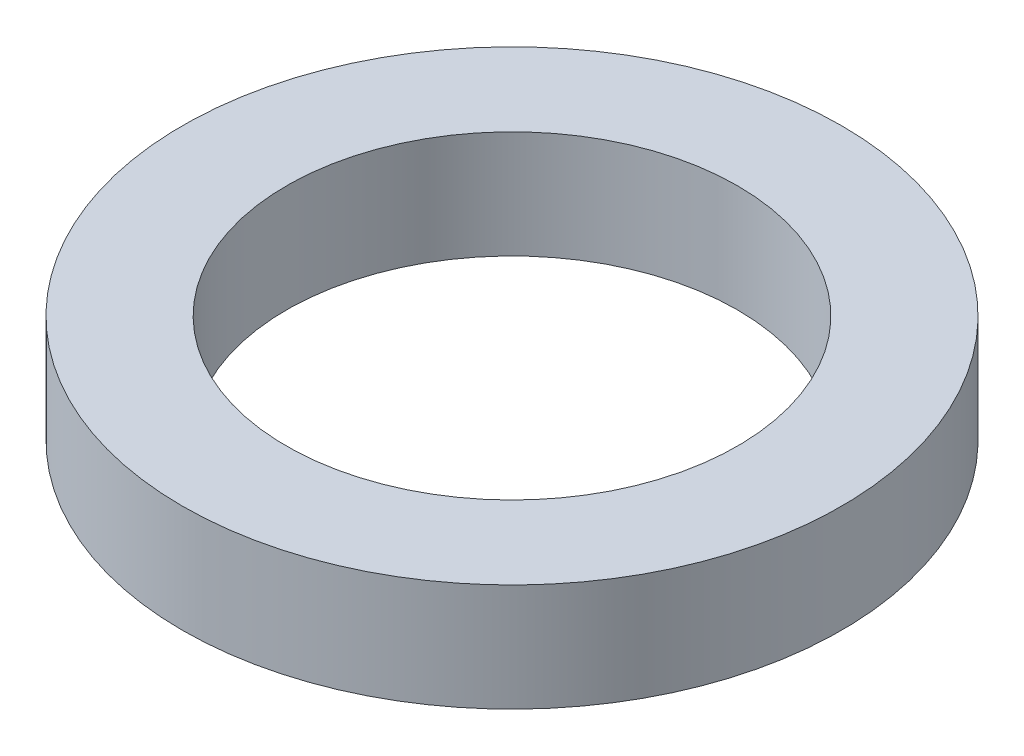
ISO-10303-21;
HEADER;
FILE_DESCRIPTION(('STEP AP214'),'2;1');
FILE_NAME('part.step','',(''),(''),'','','');
FILE_SCHEMA(('AUTOMOTIVE_DESIGN { 1 0 10303 214 1 1 1 1 }'));
ENDSEC;
DATA;
#1=APPLICATION_CONTEXT('core data for automotive mechanical design processes');
#2=APPLICATION_PROTOCOL_DEFINITION('international standard','automotive_design',2000,#1);
#3=PRODUCT_CONTEXT('',#1,'mechanical');
#4=PRODUCT('Part','Part','',(#3));
#5=PRODUCT_RELATED_PRODUCT_CATEGORY('part','',(#4));
#6=PRODUCT_DEFINITION_FORMATION('','',#4);
#7=PRODUCT_DEFINITION_CONTEXT('part definition',#1,'design');
#8=PRODUCT_DEFINITION('design','',#6,#7);
#9=PRODUCT_DEFINITION_SHAPE('','',#8);
#10=(LENGTH_UNIT() NAMED_UNIT(*) SI_UNIT(.MILLI.,.METRE.));
#11=(NAMED_UNIT(*) PLANE_ANGLE_UNIT() SI_UNIT($,.RADIAN.));
#12=(NAMED_UNIT(*) SI_UNIT($,.STERADIAN.) SOLID_ANGLE_UNIT());
#13=UNCERTAINTY_MEASURE_WITH_UNIT(LENGTH_MEASURE(1.E-05),#10,'distance_accuracy_value','');
#14=(GEOMETRIC_REPRESENTATION_CONTEXT(3) GLOBAL_UNCERTAINTY_ASSIGNED_CONTEXT((#13)) GLOBAL_UNIT_ASSIGNED_CONTEXT((#10,
#11,#12)) REPRESENTATION_CONTEXT('',''));
#15=CARTESIAN_POINT('',(0.,0.,0.));
#16=DIRECTION('',(0.,0.,1.));
#17=DIRECTION('',(1.,0.,0.));
#18=AXIS2_PLACEMENT_3D('',#15,#16,#17);
#19=CARTESIAN_POINT('',(0.,3.1,0.));
#20=DIRECTION('',(0.,1.,0.));
#21=DIRECTION('',(0.,0.,1.));
#22=AXIS2_PLACEMENT_3D('',#19,#20,#21);
#23=PLANE('',#22);
#24=CARTESIAN_POINT('',(0.,3.1,0.));
#25=DIRECTION('',(0.,1.,0.));
#26=DIRECTION('',(0.,0.,1.));
#27=AXIS2_PLACEMENT_3D('',#24,#25,#26);
#28=CIRCLE('',#27,9.5);
#29=CARTESIAN_POINT('',(0.,3.1,-9.5));
#30=VERTEX_POINT('',#29);
#31=EDGE_CURVE('E10',#30,#30,#28,.T.);
#32=ORIENTED_EDGE('',*,*,#31,.T.);
#33=EDGE_LOOP('',(#32));
#34=FACE_BOUND('',#33,.T.);
#35=CARTESIAN_POINT('',(0.,3.1,0.));
#36=DIRECTION('',(0.,1.,0.));
#37=DIRECTION('',(0.,0.,1.));
#38=AXIS2_PLACEMENT_3D('',#35,#36,#37);
#39=CIRCLE('',#38,6.5);
#40=CARTESIAN_POINT('',(0.,3.1,-6.5));
#41=VERTEX_POINT('',#40);
#42=EDGE_CURVE('E50',#41,#41,#39,.T.);
#43=ORIENTED_EDGE('',*,*,#42,.F.);
#44=EDGE_LOOP('',(#43));
#45=FACE_BOUND('',#44,.T.);
#46=ADVANCED_FACE('F37',(#34,#45),#23,.T.);
#47=CARTESIAN_POINT('',(0.,0.,0.));
#48=DIRECTION('',(0.,1.,0.));
#49=DIRECTION('',(0.,0.,1.));
#50=AXIS2_PLACEMENT_3D('',#47,#48,#49);
#51=PLANE('',#50);
#52=CARTESIAN_POINT('',(0.,0.,0.));
#53=DIRECTION('',(0.,1.,0.));
#54=DIRECTION('',(0.,0.,1.));
#55=AXIS2_PLACEMENT_3D('',#52,#53,#54);
#56=CIRCLE('',#55,9.5);
#57=CARTESIAN_POINT('',(0.,0.,-9.5));
#58=VERTEX_POINT('',#57);
#59=EDGE_CURVE('E41',#58,#58,#56,.T.);
#60=ORIENTED_EDGE('',*,*,#59,.F.);
#61=EDGE_LOOP('',(#60));
#62=FACE_BOUND('',#61,.T.);
#63=CARTESIAN_POINT('',(0.,0.,0.));
#64=DIRECTION('',(0.,1.,0.));
#65=DIRECTION('',(0.,0.,1.));
#66=AXIS2_PLACEMENT_3D('',#63,#64,#65);
#67=CIRCLE('',#66,6.5);
#68=CARTESIAN_POINT('',(0.,0.,-6.5));
#69=VERTEX_POINT('',#68);
#70=EDGE_CURVE('E52',#69,#69,#67,.T.);
#71=ORIENTED_EDGE('',*,*,#70,.T.);
#72=EDGE_LOOP('',(#71));
#73=FACE_BOUND('',#72,.T.);
#74=ADVANCED_FACE('F64',(#62,#73),#51,.F.);
#75=CARTESIAN_POINT('',(0.,3.1,0.));
#76=DIRECTION('',(0.,-1.,0.));
#77=DIRECTION('',(0.,0.,-1.));
#78=AXIS2_PLACEMENT_3D('',#75,#76,#77);
#79=CYLINDRICAL_SURFACE('',#78,9.5);
#80=CARTESIAN_POINT('',(0.,3.1,-9.5));
#81=CARTESIAN_POINT('',(0.,3.06770833333333,-9.5));
#82=CARTESIAN_POINT('',(0.,3.03541666666667,-9.5));
#83=CARTESIAN_POINT('',(0.,2.97083333333333,-9.5));
#84=CARTESIAN_POINT('',(0.,2.93854166666667,-9.5));
#85=CARTESIAN_POINT('',(0.,2.87395833333333,-9.5));
#86=CARTESIAN_POINT('',(0.,2.84166666666667,-9.5));
#87=CARTESIAN_POINT('',(0.,2.77708333333333,-9.5));
#88=CARTESIAN_POINT('',(0.,2.74479166666667,-9.5));
#89=CARTESIAN_POINT('',(0.,2.68020833333333,-9.5));
#90=CARTESIAN_POINT('',(0.,2.64791666666667,-9.5));
#91=CARTESIAN_POINT('',(0.,2.58333333333333,-9.5));
#92=CARTESIAN_POINT('',(0.,2.55104166666667,-9.5));
#93=CARTESIAN_POINT('',(0.,2.48645833333333,-9.5));
#94=CARTESIAN_POINT('',(0.,2.45416666666667,-9.5));
#95=CARTESIAN_POINT('',(0.,2.38958333333333,-9.5));
#96=CARTESIAN_POINT('',(0.,2.35729166666667,-9.5));
#97=CARTESIAN_POINT('',(0.,2.29270833333333,-9.5));
#98=CARTESIAN_POINT('',(0.,2.26041666666667,-9.5));
#99=CARTESIAN_POINT('',(0.,2.19583333333333,-9.5));
#100=CARTESIAN_POINT('',(0.,2.16354166666667,-9.5));
#101=CARTESIAN_POINT('',(0.,2.09895833333333,-9.5));
#102=CARTESIAN_POINT('',(0.,2.06666666666667,-9.5));
#103=CARTESIAN_POINT('',(0.,2.00208333333333,-9.5));
#104=CARTESIAN_POINT('',(0.,1.96979166666667,-9.5));
#105=CARTESIAN_POINT('',(0.,1.90520833333333,-9.5));
#106=CARTESIAN_POINT('',(0.,1.87291666666667,-9.5));
#107=CARTESIAN_POINT('',(0.,1.80833333333333,-9.5));
#108=CARTESIAN_POINT('',(0.,1.77604166666667,-9.5));
#109=CARTESIAN_POINT('',(0.,1.71145833333333,-9.5));
#110=CARTESIAN_POINT('',(0.,1.67916666666667,-9.5));
#111=CARTESIAN_POINT('',(0.,1.61458333333333,-9.5));
#112=CARTESIAN_POINT('',(0.,1.58229166666667,-9.5));
#113=CARTESIAN_POINT('',(0.,1.51770833333333,-9.5));
#114=CARTESIAN_POINT('',(0.,1.48541666666667,-9.5));
#115=CARTESIAN_POINT('',(0.,1.42083333333333,-9.5));
#116=CARTESIAN_POINT('',(0.,1.38854166666667,-9.5));
#117=CARTESIAN_POINT('',(0.,1.32395833333333,-9.5));
#118=CARTESIAN_POINT('',(0.,1.29166666666667,-9.5));
#119=CARTESIAN_POINT('',(0.,1.22708333333333,-9.5));
#120=CARTESIAN_POINT('',(0.,1.19479166666667,-9.5));
#121=CARTESIAN_POINT('',(0.,1.13020833333333,-9.5));
#122=CARTESIAN_POINT('',(0.,1.09791666666667,-9.5));
#123=CARTESIAN_POINT('',(0.,1.03333333333333,-9.5));
#124=CARTESIAN_POINT('',(0.,1.00104166666667,-9.5));
#125=CARTESIAN_POINT('',(0.,0.936458333333333,-9.5));
#126=CARTESIAN_POINT('',(0.,0.904166666666667,-9.5));
#127=CARTESIAN_POINT('',(0.,0.839583333333333,-9.5));
#128=CARTESIAN_POINT('',(0.,0.807291666666667,-9.5));
#129=CARTESIAN_POINT('',(0.,0.742708333333333,-9.5));
#130=CARTESIAN_POINT('',(0.,0.710416666666667,-9.5));
#131=CARTESIAN_POINT('',(0.,0.645833333333333,-9.5));
#132=CARTESIAN_POINT('',(0.,0.613541666666667,-9.5));
#133=CARTESIAN_POINT('',(0.,0.548958333333333,-9.5));
#134=CARTESIAN_POINT('',(0.,0.516666666666667,-9.5));
#135=CARTESIAN_POINT('',(0.,0.452083333333333,-9.5));
#136=CARTESIAN_POINT('',(0.,0.419791666666667,-9.5));
#137=CARTESIAN_POINT('',(0.,0.355208333333333,-9.5));
#138=CARTESIAN_POINT('',(0.,0.322916666666667,-9.5));
#139=CARTESIAN_POINT('',(0.,0.258333333333333,-9.5));
#140=CARTESIAN_POINT('',(0.,0.226041666666667,-9.5));
#141=CARTESIAN_POINT('',(0.,0.161458333333333,-9.5));
#142=CARTESIAN_POINT('',(0.,0.129166666666667,-9.5));
#143=CARTESIAN_POINT('',(0.,0.0645833333333335,-9.5));
#144=CARTESIAN_POINT('',(0.,0.0322916666666667,-9.5));
#145=CARTESIAN_POINT('',(0.,0.,-9.5));
#146=B_SPLINE_CURVE_WITH_KNOTS('',3,(#80,#81,#82,#83,#84,#85,#86,#87,#88,#89,#90,#91,#92,#93,
#94,#95,#96,#97,#98,#99,#100,#101,#102,#103,#104,#105,#106,#107,#108,#109,#110,#111,#112,#113,
#114,#115,#116,#117,#118,#119,#120,#121,#122,#123,#124,#125,#126,#127,#128,#129,#130,#131,#132,
#133,#134,#135,#136,#137,#138,#139,#140,#141,#142,#143,#144,#145),.UNSPECIFIED.,.F.,.F.,(4,2,2,
2,2,2,2,2,2,2,2,2,2,2,2,2,2,2,2,2,2,2,2,2,2,2,2,2,2,2,2,2,4),(0.,0.0968749999999997,0.19375,
0.290625,0.3875,0.484375,0.58125,0.678125,0.775,0.871874999999999,0.96875,1.065625,1.1625,
1.259375,1.35625,1.453125,1.55,1.646875,1.74375,1.840625,1.9375,2.034375,2.13125,2.228125,2.325,
2.421875,2.51875,2.615625,2.7125,2.809375,2.90625,3.003125,3.1),.UNSPECIFIED.);
#147=EDGE_CURVE('BSEAM39',#30,#58,#146,.T.);
#148=ORIENTED_EDGE('',*,*,#31,.F.);
#149=ORIENTED_EDGE('',*,*,#59,.T.);
#150=ORIENTED_EDGE('',*,*,#147,.T.);
#151=ORIENTED_EDGE('',*,*,#147,.F.);
#152=EDGE_LOOP('',(#148,#150,#149,#151));
#153=FACE_BOUND('',#152,.T.);
#154=ADVANCED_FACE('F39',(#153),#79,.T.);
#155=CARTESIAN_POINT('',(0.,3.1,0.));
#156=DIRECTION('',(0.,-1.,0.));
#157=DIRECTION('',(0.,0.,-1.));
#158=AXIS2_PLACEMENT_3D('',#155,#156,#157);
#159=CYLINDRICAL_SURFACE('',#158,6.5);
#160=CARTESIAN_POINT('',(0.,3.1,-6.5));
#161=CARTESIAN_POINT('',(0.,3.06770833333333,-6.5));
#162=CARTESIAN_POINT('',(0.,3.03541666666667,-6.5));
#163=CARTESIAN_POINT('',(0.,2.97083333333333,-6.5));
#164=CARTESIAN_POINT('',(0.,2.93854166666667,-6.5));
#165=CARTESIAN_POINT('',(0.,2.87395833333333,-6.5));
#166=CARTESIAN_POINT('',(0.,2.84166666666667,-6.5));
#167=CARTESIAN_POINT('',(0.,2.77708333333333,-6.5));
#168=CARTESIAN_POINT('',(0.,2.74479166666667,-6.5));
#169=CARTESIAN_POINT('',(0.,2.68020833333333,-6.5));
#170=CARTESIAN_POINT('',(0.,2.64791666666667,-6.5));
#171=CARTESIAN_POINT('',(0.,2.58333333333333,-6.5));
#172=CARTESIAN_POINT('',(0.,2.55104166666667,-6.5));
#173=CARTESIAN_POINT('',(0.,2.48645833333333,-6.5));
#174=CARTESIAN_POINT('',(0.,2.45416666666667,-6.5));
#175=CARTESIAN_POINT('',(0.,2.38958333333333,-6.5));
#176=CARTESIAN_POINT('',(0.,2.35729166666667,-6.5));
#177=CARTESIAN_POINT('',(0.,2.29270833333333,-6.5));
#178=CARTESIAN_POINT('',(0.,2.26041666666667,-6.5));
#179=CARTESIAN_POINT('',(0.,2.19583333333333,-6.5));
#180=CARTESIAN_POINT('',(0.,2.16354166666667,-6.5));
#181=CARTESIAN_POINT('',(0.,2.09895833333333,-6.5));
#182=CARTESIAN_POINT('',(0.,2.06666666666667,-6.5));
#183=CARTESIAN_POINT('',(0.,2.00208333333333,-6.5));
#184=CARTESIAN_POINT('',(0.,1.96979166666667,-6.5));
#185=CARTESIAN_POINT('',(0.,1.90520833333333,-6.5));
#186=CARTESIAN_POINT('',(0.,1.87291666666667,-6.5));
#187=CARTESIAN_POINT('',(0.,1.80833333333333,-6.5));
#188=CARTESIAN_POINT('',(0.,1.77604166666667,-6.5));
#189=CARTESIAN_POINT('',(0.,1.71145833333333,-6.5));
#190=CARTESIAN_POINT('',(0.,1.67916666666667,-6.5));
#191=CARTESIAN_POINT('',(0.,1.61458333333333,-6.5));
#192=CARTESIAN_POINT('',(0.,1.58229166666667,-6.5));
#193=CARTESIAN_POINT('',(0.,1.51770833333333,-6.5));
#194=CARTESIAN_POINT('',(0.,1.48541666666667,-6.5));
#195=CARTESIAN_POINT('',(0.,1.42083333333333,-6.5));
#196=CARTESIAN_POINT('',(0.,1.38854166666667,-6.5));
#197=CARTESIAN_POINT('',(0.,1.32395833333333,-6.5));
#198=CARTESIAN_POINT('',(0.,1.29166666666667,-6.5));
#199=CARTESIAN_POINT('',(0.,1.22708333333333,-6.5));
#200=CARTESIAN_POINT('',(0.,1.19479166666667,-6.5));
#201=CARTESIAN_POINT('',(0.,1.13020833333333,-6.5));
#202=CARTESIAN_POINT('',(0.,1.09791666666667,-6.5));
#203=CARTESIAN_POINT('',(0.,1.03333333333333,-6.5));
#204=CARTESIAN_POINT('',(0.,1.00104166666667,-6.5));
#205=CARTESIAN_POINT('',(0.,0.936458333333333,-6.5));
#206=CARTESIAN_POINT('',(0.,0.904166666666667,-6.5));
#207=CARTESIAN_POINT('',(0.,0.839583333333333,-6.5));
#208=CARTESIAN_POINT('',(0.,0.807291666666667,-6.5));
#209=CARTESIAN_POINT('',(0.,0.742708333333333,-6.5));
#210=CARTESIAN_POINT('',(0.,0.710416666666667,-6.5));
#211=CARTESIAN_POINT('',(0.,0.645833333333333,-6.5));
#212=CARTESIAN_POINT('',(0.,0.613541666666667,-6.5));
#213=CARTESIAN_POINT('',(0.,0.548958333333333,-6.5));
#214=CARTESIAN_POINT('',(0.,0.516666666666667,-6.5));
#215=CARTESIAN_POINT('',(0.,0.452083333333333,-6.5));
#216=CARTESIAN_POINT('',(0.,0.419791666666667,-6.5));
#217=CARTESIAN_POINT('',(0.,0.355208333333333,-6.5));
#218=CARTESIAN_POINT('',(0.,0.322916666666667,-6.5));
#219=CARTESIAN_POINT('',(0.,0.258333333333333,-6.5));
#220=CARTESIAN_POINT('',(0.,0.226041666666667,-6.5));
#221=CARTESIAN_POINT('',(0.,0.161458333333333,-6.5));
#222=CARTESIAN_POINT('',(0.,0.129166666666667,-6.5));
#223=CARTESIAN_POINT('',(0.,0.0645833333333335,-6.5));
#224=CARTESIAN_POINT('',(0.,0.0322916666666667,-6.5));
#225=CARTESIAN_POINT('',(0.,0.,-6.5));
#226=B_SPLINE_CURVE_WITH_KNOTS('',3,(#160,#161,#162,#163,#164,#165,#166,#167,#168,#169,#170,
#171,#172,#173,#174,#175,#176,#177,#178,#179,#180,#181,#182,#183,#184,#185,#186,#187,#188,#189,
#190,#191,#192,#193,#194,#195,#196,#197,#198,#199,#200,#201,#202,#203,#204,#205,#206,#207,#208,
#209,#210,#211,#212,#213,#214,#215,#216,#217,#218,#219,#220,#221,#222,#223,#224,#225),
.UNSPECIFIED.,.F.,.F.,(4,2,2,2,2,2,2,2,2,2,2,2,2,2,2,2,2,2,2,2,2,2,2,2,2,2,2,2,2,2,2,2,4),(0.,
0.0968749999999997,0.19375,0.290625,0.3875,0.484375,0.58125,0.678125,0.775,0.871874999999999,
0.96875,1.065625,1.1625,1.259375,1.35625,1.453125,1.55,1.646875,1.74375,1.840625,1.9375,
2.034375,2.13125,2.228125,2.325,2.421875,2.51875,2.615625,2.7125,2.809375,2.90625,3.003125,3.1),.UNSPECIFIED.);
#227=EDGE_CURVE('BSEAM60',#41,#69,#226,.T.);
#228=ORIENTED_EDGE('',*,*,#42,.T.);
#229=ORIENTED_EDGE('',*,*,#70,.F.);
#230=ORIENTED_EDGE('',*,*,#227,.T.);
#231=ORIENTED_EDGE('',*,*,#227,.F.);
#232=EDGE_LOOP('',(#228,#230,#229,#231));
#233=FACE_BOUND('',#232,.T.);
#234=ADVANCED_FACE('F60',(#233),#159,.F.);
#235=CLOSED_SHELL('',(#46,#74,#154,#234));
#236=MANIFOLD_SOLID_BREP('B2',#235);
#237=ADVANCED_BREP_SHAPE_REPRESENTATION('',(#18,#236),#14);
#238=SHAPE_DEFINITION_REPRESENTATION(#9,#237);
ENDSEC;
END-ISO-10303-21;
